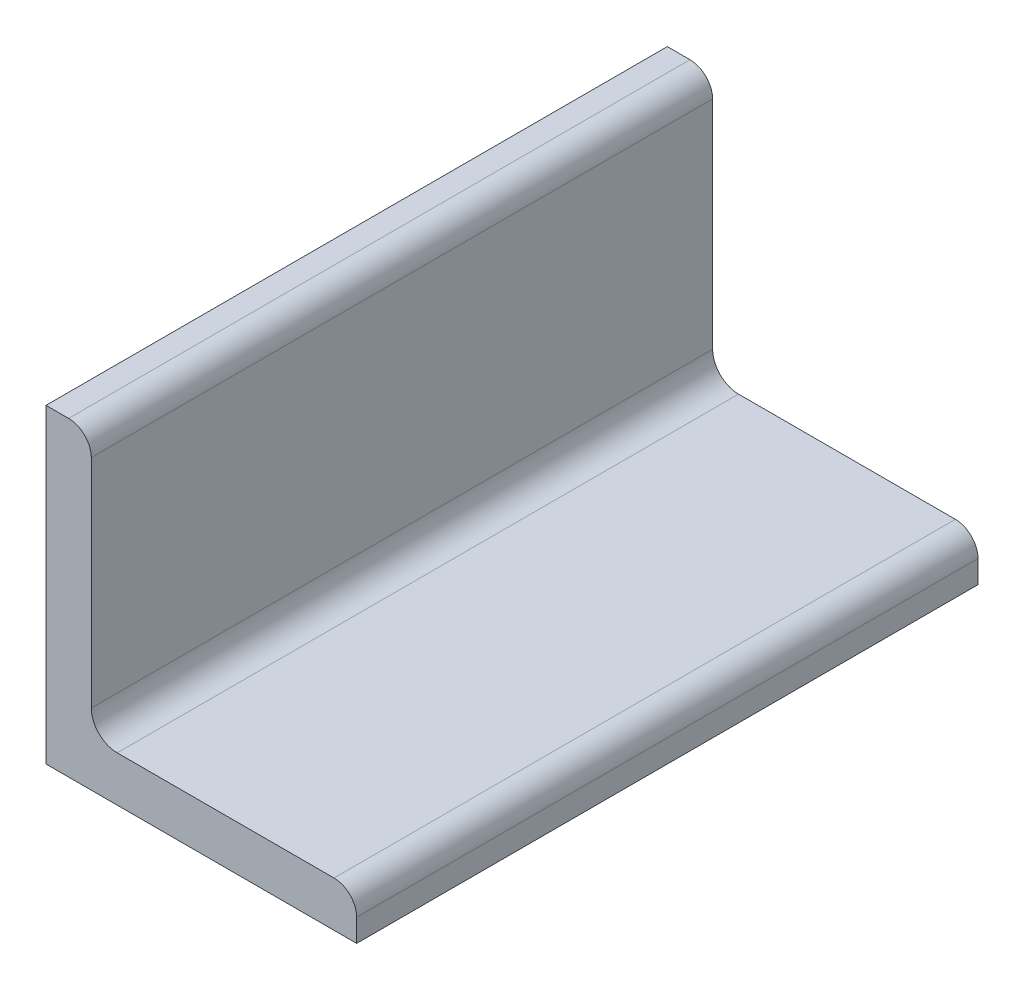
ISO-10303-21;
HEADER;
FILE_DESCRIPTION(('STEP AP214'),'2;1');
FILE_NAME('part.step','',(''),(''),'','','');
FILE_SCHEMA(('AUTOMOTIVE_DESIGN { 1 0 10303 214 1 1 1 1 }'));
ENDSEC;
DATA;
#1=APPLICATION_CONTEXT('core data for automotive mechanical design processes');
#2=APPLICATION_PROTOCOL_DEFINITION('international standard','automotive_design',2000,#1);
#3=PRODUCT_CONTEXT('',#1,'mechanical');
#4=PRODUCT('Part','Part','',(#3));
#5=PRODUCT_RELATED_PRODUCT_CATEGORY('part','',(#4));
#6=PRODUCT_DEFINITION_FORMATION('','',#4);
#7=PRODUCT_DEFINITION_CONTEXT('part definition',#1,'design');
#8=PRODUCT_DEFINITION('design','',#6,#7);
#9=PRODUCT_DEFINITION_SHAPE('','',#8);
#10=(LENGTH_UNIT() NAMED_UNIT(*) SI_UNIT(.MILLI.,.METRE.));
#11=(NAMED_UNIT(*) PLANE_ANGLE_UNIT() SI_UNIT($,.RADIAN.));
#12=(NAMED_UNIT(*) SI_UNIT($,.STERADIAN.) SOLID_ANGLE_UNIT());
#13=UNCERTAINTY_MEASURE_WITH_UNIT(LENGTH_MEASURE(1.E-05),#10,'distance_accuracy_value','');
#14=(GEOMETRIC_REPRESENTATION_CONTEXT(3) GLOBAL_UNCERTAINTY_ASSIGNED_CONTEXT((#13)) GLOBAL_UNIT_ASSIGNED_CONTEXT((#10,
#11,#12)) REPRESENTATION_CONTEXT('',''));
#15=CARTESIAN_POINT('',(0.,0.,0.));
#16=DIRECTION('',(0.,0.,1.));
#17=DIRECTION('',(1.,0.,0.));
#18=AXIS2_PLACEMENT_3D('',#15,#16,#17);
#19=CARTESIAN_POINT('',(0.425014111727251,152.925428131371,304.8));
#20=DIRECTION('',(1.,0.,0.));
#21=DIRECTION('',(0.,0.,-1.));
#22=AXIS2_PLACEMENT_3D('',#19,#20,#21);
#23=PLANE('',#22);
#24=DIRECTION('',(0.,-1.,0.));
#25=VECTOR('',#24,1.);
#26=CARTESIAN_POINT('',(0.425014111727251,152.925428131371,0.));
#27=LINE('',#26,#25);
#28=CARTESIAN_POINT('',(0.425014111727251,152.925428131371,0.));
#29=VERTEX_POINT('',#28);
#30=CARTESIAN_POINT('',(0.425014111727251,0.52542813137111,0.));
#31=VERTEX_POINT('',#30);
#32=EDGE_CURVE('E135',#29,#31,#27,.T.);
#33=ORIENTED_EDGE('',*,*,#32,.T.);
#34=DIRECTION('',(0.,0.,-1.));
#35=VECTOR('',#34,1.);
#36=CARTESIAN_POINT('',(0.425014111727251,0.52542813137111,304.8));
#37=LINE('',#36,#35);
#38=CARTESIAN_POINT('',(0.425014111727251,0.52542813137111,304.8));
#39=VERTEX_POINT('',#38);
#40=EDGE_CURVE('E11',#39,#31,#37,.T.);
#41=ORIENTED_EDGE('',*,*,#40,.F.);
#42=DIRECTION('',(0.,-1.,0.));
#43=VECTOR('',#42,1.);
#44=CARTESIAN_POINT('',(0.425014111727251,152.925428131371,304.8));
#45=LINE('',#44,#43);
#46=CARTESIAN_POINT('',(0.425014111727251,152.925428131371,304.8));
#47=VERTEX_POINT('',#46);
#48=EDGE_CURVE('E151',#47,#39,#45,.T.);
#49=ORIENTED_EDGE('',*,*,#48,.F.);
#50=DIRECTION('',(0.,0.,-1.));
#51=VECTOR('',#50,1.);
#52=CARTESIAN_POINT('',(0.425014111727251,152.925428131371,304.8));
#53=LINE('',#52,#51);
#54=EDGE_CURVE('E131',#47,#29,#53,.T.);
#55=ORIENTED_EDGE('',*,*,#54,.T.);
#56=EDGE_LOOP('',(#33,#41,#49,#55));
#57=FACE_BOUND('',#56,.T.);
#58=ADVANCED_FACE('F33',(#57),#23,.F.);
#59=CARTESIAN_POINT('',(0.425014111727251,0.52542813137111,304.8));
#60=DIRECTION('',(0.,1.,0.));
#61=DIRECTION('',(0.,0.,1.));
#62=AXIS2_PLACEMENT_3D('',#59,#60,#61);
#63=PLANE('',#62);
#64=DIRECTION('',(1.,0.,0.));
#65=VECTOR('',#64,1.);
#66=CARTESIAN_POINT('',(0.425014111727251,0.52542813137111,0.));
#67=LINE('',#66,#65);
#68=CARTESIAN_POINT('',(152.825014111727,0.52542813137111,0.));
#69=VERTEX_POINT('',#68);
#70=EDGE_CURVE('E138',#31,#69,#67,.T.);
#71=ORIENTED_EDGE('',*,*,#70,.T.);
#72=DIRECTION('',(0.,0.,-1.));
#73=VECTOR('',#72,1.);
#74=CARTESIAN_POINT('',(152.825014111727,0.52542813137111,304.8));
#75=LINE('',#74,#73);
#76=CARTESIAN_POINT('',(152.825014111727,0.52542813137111,304.8));
#77=VERTEX_POINT('',#76);
#78=EDGE_CURVE('E41',#77,#69,#75,.T.);
#79=ORIENTED_EDGE('',*,*,#78,.F.);
#80=DIRECTION('',(1.,0.,0.));
#81=VECTOR('',#80,1.);
#82=CARTESIAN_POINT('',(0.425014111727251,0.52542813137111,304.8));
#83=LINE('',#82,#81);
#84=EDGE_CURVE('E95',#39,#77,#83,.T.);
#85=ORIENTED_EDGE('',*,*,#84,.F.);
#86=ORIENTED_EDGE('',*,*,#40,.T.);
#87=EDGE_LOOP('',(#71,#79,#85,#86));
#88=FACE_BOUND('',#87,.T.);
#89=ADVANCED_FACE('F194',(#88),#63,.F.);
#90=CARTESIAN_POINT('',(152.825014111727,0.52542813137111,304.8));
#91=DIRECTION('',(-1.,0.,0.));
#92=DIRECTION('',(0.,0.,1.));
#93=AXIS2_PLACEMENT_3D('',#90,#91,#92);
#94=PLANE('',#93);
#95=DIRECTION('',(0.,1.,0.));
#96=VECTOR('',#95,1.);
#97=CARTESIAN_POINT('',(152.825014111727,0.52542813137111,0.));
#98=LINE('',#97,#96);
#99=CARTESIAN_POINT('',(152.825014111727,11.6379281313711,0.));
#100=VERTEX_POINT('',#99);
#101=EDGE_CURVE('E140',#69,#100,#98,.T.);
#102=ORIENTED_EDGE('',*,*,#101,.T.);
#103=DIRECTION('',(0.,0.,-1.));
#104=VECTOR('',#103,1.);
#105=CARTESIAN_POINT('',(152.825014111727,11.6379281313711,304.8));
#106=LINE('',#105,#104);
#107=CARTESIAN_POINT('',(152.825014111727,11.6379281313711,304.8));
#108=VERTEX_POINT('',#107);
#109=EDGE_CURVE('E161',#108,#100,#106,.T.);
#110=ORIENTED_EDGE('',*,*,#109,.F.);
#111=DIRECTION('',(0.,1.,0.));
#112=VECTOR('',#111,1.);
#113=CARTESIAN_POINT('',(152.825014111727,0.52542813137111,304.8));
#114=LINE('',#113,#112);
#115=EDGE_CURVE('E169',#77,#108,#114,.T.);
#116=ORIENTED_EDGE('',*,*,#115,.F.);
#117=ORIENTED_EDGE('',*,*,#78,.T.);
#118=EDGE_LOOP('',(#102,#110,#116,#117));
#119=FACE_BOUND('',#118,.T.);
#120=ADVANCED_FACE('F167',(#119),#94,.F.);
#121=CARTESIAN_POINT('',(141.712514111727,11.6379281313711,304.8));
#122=DIRECTION('',(0.,0.,-1.));
#123=DIRECTION('',(-1.,0.,0.));
#124=AXIS2_PLACEMENT_3D('',#121,#122,#123);
#125=CYLINDRICAL_SURFACE('',#124,11.1125);
#126=CARTESIAN_POINT('',(141.712514111727,11.6379281313711,0.));
#127=DIRECTION('',(0.,0.,1.));
#128=DIRECTION('',(1.,0.,0.));
#129=AXIS2_PLACEMENT_3D('',#126,#127,#128);
#130=CIRCLE('',#129,11.1125);
#131=CARTESIAN_POINT('',(141.712514111727,22.7504281313711,0.));
#132=VERTEX_POINT('',#131);
#133=EDGE_CURVE('E142',#100,#132,#130,.T.);
#134=ORIENTED_EDGE('',*,*,#133,.T.);
#135=DIRECTION('',(0.,0.,-1.));
#136=VECTOR('',#135,1.);
#137=CARTESIAN_POINT('',(141.712514111727,22.7504281313711,304.8));
#138=LINE('',#137,#136);
#139=CARTESIAN_POINT('',(141.712514111727,22.7504281313711,304.8));
#140=VERTEX_POINT('',#139);
#141=EDGE_CURVE('E158',#140,#132,#138,.T.);
#142=ORIENTED_EDGE('',*,*,#141,.F.);
#143=CARTESIAN_POINT('',(141.712514111727,11.6379281313711,304.8));
#144=DIRECTION('',(0.,0.,1.));
#145=DIRECTION('',(1.,0.,0.));
#146=AXIS2_PLACEMENT_3D('',#143,#144,#145);
#147=CIRCLE('',#146,11.1125);
#148=EDGE_CURVE('E185',#108,#140,#147,.T.);
#149=ORIENTED_EDGE('',*,*,#148,.F.);
#150=ORIENTED_EDGE('',*,*,#109,.T.);
#151=EDGE_LOOP('',(#134,#142,#149,#150));
#152=FACE_BOUND('',#151,.T.);
#153=ADVANCED_FACE('F178',(#152),#125,.T.);
#154=CARTESIAN_POINT('',(141.712514111727,22.7504281313711,304.8));
#155=DIRECTION('',(0.,-1.,0.));
#156=DIRECTION('',(0.,0.,-1.));
#157=AXIS2_PLACEMENT_3D('',#154,#155,#156);
#158=PLANE('',#157);
#159=DIRECTION('',(-1.,0.,0.));
#160=VECTOR('',#159,1.);
#161=CARTESIAN_POINT('',(141.712514111727,22.7504281313711,0.));
#162=LINE('',#161,#160);
#163=CARTESIAN_POINT('',(35.3500141117272,22.7504281313711,0.));
#164=VERTEX_POINT('',#163);
#165=EDGE_CURVE('E144',#132,#164,#162,.T.);
#166=ORIENTED_EDGE('',*,*,#165,.T.);
#167=DIRECTION('',(0.,0.,-1.));
#168=VECTOR('',#167,1.);
#169=CARTESIAN_POINT('',(35.3500141117272,22.7504281313711,304.8));
#170=LINE('',#169,#168);
#171=CARTESIAN_POINT('',(35.3500141117272,22.7504281313711,304.8));
#172=VERTEX_POINT('',#171);
#173=EDGE_CURVE('E155',#172,#164,#170,.T.);
#174=ORIENTED_EDGE('',*,*,#173,.F.);
#175=DIRECTION('',(-1.,0.,0.));
#176=VECTOR('',#175,1.);
#177=CARTESIAN_POINT('',(141.712514111727,22.7504281313711,304.8));
#178=LINE('',#177,#176);
#179=EDGE_CURVE('E184',#140,#172,#178,.T.);
#180=ORIENTED_EDGE('',*,*,#179,.F.);
#181=ORIENTED_EDGE('',*,*,#141,.T.);
#182=EDGE_LOOP('',(#166,#174,#180,#181));
#183=FACE_BOUND('',#182,.T.);
#184=ADVANCED_FACE('F182',(#183),#158,.F.);
#185=CARTESIAN_POINT('',(35.3500141117272,35.4504281313711,304.8));
#186=DIRECTION('',(0.,0.,-1.));
#187=DIRECTION('',(-1.,0.,0.));
#188=AXIS2_PLACEMENT_3D('',#185,#186,#187);
#189=CYLINDRICAL_SURFACE('',#188,12.7);
#190=CARTESIAN_POINT('',(35.3500141117272,35.4504281313711,0.));
#191=DIRECTION('',(0.,0.,-1.));
#192=DIRECTION('',(1.,0.,0.));
#193=AXIS2_PLACEMENT_3D('',#190,#191,#192);
#194=CIRCLE('',#193,12.7);
#195=CARTESIAN_POINT('',(22.6500141117272,35.4504281313711,0.));
#196=VERTEX_POINT('',#195);
#197=EDGE_CURVE('E146',#164,#196,#194,.T.);
#198=ORIENTED_EDGE('',*,*,#197,.T.);
#199=DIRECTION('',(0.,0.,-1.));
#200=VECTOR('',#199,1.);
#201=CARTESIAN_POINT('',(22.6500141117272,35.4504281313711,304.8));
#202=LINE('',#201,#200);
#203=CARTESIAN_POINT('',(22.6500141117272,35.4504281313711,304.8));
#204=VERTEX_POINT('',#203);
#205=EDGE_CURVE('E126',#204,#196,#202,.T.);
#206=ORIENTED_EDGE('',*,*,#205,.F.);
#207=CARTESIAN_POINT('',(35.3500141117272,35.4504281313711,304.8));
#208=DIRECTION('',(0.,0.,-1.));
#209=DIRECTION('',(1.,0.,0.));
#210=AXIS2_PLACEMENT_3D('',#207,#208,#209);
#211=CIRCLE('',#210,12.7);
#212=EDGE_CURVE('E117',#172,#204,#211,.T.);
#213=ORIENTED_EDGE('',*,*,#212,.F.);
#214=ORIENTED_EDGE('',*,*,#173,.T.);
#215=EDGE_LOOP('',(#198,#206,#213,#214));
#216=FACE_BOUND('',#215,.T.);
#217=ADVANCED_FACE('F206',(#216),#189,.F.);
#218=CARTESIAN_POINT('',(22.6500141117273,35.4504281313711,304.8));
#219=DIRECTION('',(-1.,0.,0.));
#220=DIRECTION('',(0.,0.,1.));
#221=AXIS2_PLACEMENT_3D('',#218,#219,#220);
#222=PLANE('',#221);
#223=DIRECTION('',(0.,1.,0.));
#224=VECTOR('',#223,1.);
#225=CARTESIAN_POINT('',(22.6500141117273,35.4504281313711,0.));
#226=LINE('',#225,#224);
#227=CARTESIAN_POINT('',(22.6500141117273,141.812928131371,0.));
#228=VERTEX_POINT('',#227);
#229=EDGE_CURVE('E125',#196,#228,#226,.T.);
#230=ORIENTED_EDGE('',*,*,#229,.T.);
#231=DIRECTION('',(0.,0.,-1.));
#232=VECTOR('',#231,1.);
#233=CARTESIAN_POINT('',(22.6500141117273,141.812928131371,304.8));
#234=LINE('',#233,#232);
#235=CARTESIAN_POINT('',(22.6500141117273,141.812928131371,304.8));
#236=VERTEX_POINT('',#235);
#237=EDGE_CURVE('E122',#236,#228,#234,.T.);
#238=ORIENTED_EDGE('',*,*,#237,.F.);
#239=DIRECTION('',(0.,1.,0.));
#240=VECTOR('',#239,1.);
#241=CARTESIAN_POINT('',(22.6500141117273,35.4504281313711,304.8));
#242=LINE('',#241,#240);
#243=EDGE_CURVE('E111',#204,#236,#242,.T.);
#244=ORIENTED_EDGE('',*,*,#243,.F.);
#245=ORIENTED_EDGE('',*,*,#205,.T.);
#246=EDGE_LOOP('',(#230,#238,#244,#245));
#247=FACE_BOUND('',#246,.T.);
#248=ADVANCED_FACE('F123',(#247),#222,.F.);
#249=CARTESIAN_POINT('',(11.5375141117272,141.812928131371,304.8));
#250=DIRECTION('',(0.,0.,-1.));
#251=DIRECTION('',(-1.,0.,0.));
#252=AXIS2_PLACEMENT_3D('',#249,#250,#251);
#253=CYLINDRICAL_SURFACE('',#252,11.1125);
#254=CARTESIAN_POINT('',(11.5375141117272,141.812928131371,0.));
#255=DIRECTION('',(0.,0.,1.));
#256=DIRECTION('',(1.,0.,0.));
#257=AXIS2_PLACEMENT_3D('',#254,#255,#256);
#258=CIRCLE('',#257,11.1125);
#259=CARTESIAN_POINT('',(11.5375141117273,152.925428131371,0.));
#260=VERTEX_POINT('',#259);
#261=EDGE_CURVE('E81',#228,#260,#258,.T.);
#262=ORIENTED_EDGE('',*,*,#261,.T.);
#263=DIRECTION('',(0.,0.,-1.));
#264=VECTOR('',#263,1.);
#265=CARTESIAN_POINT('',(11.5375141117273,152.925428131371,304.8));
#266=LINE('',#265,#264);
#267=CARTESIAN_POINT('',(11.5375141117273,152.925428131371,304.8));
#268=VERTEX_POINT('',#267);
#269=EDGE_CURVE('E127',#268,#260,#266,.T.);
#270=ORIENTED_EDGE('',*,*,#269,.F.);
#271=CARTESIAN_POINT('',(11.5375141117272,141.812928131371,304.8));
#272=DIRECTION('',(0.,0.,1.));
#273=DIRECTION('',(1.,0.,0.));
#274=AXIS2_PLACEMENT_3D('',#271,#272,#273);
#275=CIRCLE('',#274,11.1125);
#276=EDGE_CURVE('E115',#236,#268,#275,.T.);
#277=ORIENTED_EDGE('',*,*,#276,.F.);
#278=ORIENTED_EDGE('',*,*,#237,.T.);
#279=EDGE_LOOP('',(#262,#270,#277,#278));
#280=FACE_BOUND('',#279,.T.);
#281=ADVANCED_FACE('F129',(#280),#253,.T.);
#282=CARTESIAN_POINT('',(11.5375141117273,152.925428131371,304.8));
#283=DIRECTION('',(0.,-1.,0.));
#284=DIRECTION('',(0.,0.,-1.));
#285=AXIS2_PLACEMENT_3D('',#282,#283,#284);
#286=PLANE('',#285);
#287=DIRECTION('',(-1.,0.,0.));
#288=VECTOR('',#287,1.);
#289=CARTESIAN_POINT('',(11.5375141117273,152.925428131371,0.));
#290=LINE('',#289,#288);
#291=EDGE_CURVE('E87',#260,#29,#290,.T.);
#292=ORIENTED_EDGE('',*,*,#291,.T.);
#293=ORIENTED_EDGE('',*,*,#54,.F.);
#294=DIRECTION('',(-1.,0.,0.));
#295=VECTOR('',#294,1.);
#296=CARTESIAN_POINT('',(11.5375141117273,152.925428131371,304.8));
#297=LINE('',#296,#295);
#298=EDGE_CURVE('E49',#268,#47,#297,.T.);
#299=ORIENTED_EDGE('',*,*,#298,.F.);
#300=ORIENTED_EDGE('',*,*,#269,.T.);
#301=EDGE_LOOP('',(#292,#293,#299,#300));
#302=FACE_BOUND('',#301,.T.);
#303=ADVANCED_FACE('F214',(#302),#286,.F.);
#304=CARTESIAN_POINT('',(141.712514111727,11.6379281313711,304.8));
#305=DIRECTION('',(0.,0.,1.));
#306=DIRECTION('',(1.,0.,0.));
#307=AXIS2_PLACEMENT_3D('',#304,#305,#306);
#308=PLANE('',#307);
#309=ORIENTED_EDGE('',*,*,#48,.T.);
#310=ORIENTED_EDGE('',*,*,#84,.T.);
#311=ORIENTED_EDGE('',*,*,#115,.T.);
#312=ORIENTED_EDGE('',*,*,#148,.T.);
#313=ORIENTED_EDGE('',*,*,#179,.T.);
#314=ORIENTED_EDGE('',*,*,#212,.T.);
#315=ORIENTED_EDGE('',*,*,#243,.T.);
#316=ORIENTED_EDGE('',*,*,#276,.T.);
#317=ORIENTED_EDGE('',*,*,#298,.T.);
#318=EDGE_LOOP('',(#309,#310,#311,#312,#313,#314,#315,#316,#317));
#319=FACE_BOUND('',#318,.T.);
#320=ADVANCED_FACE('F113',(#319),#308,.T.);
#321=CARTESIAN_POINT('',(141.712514111727,11.6379281313711,0.));
#322=DIRECTION('',(0.,0.,1.));
#323=DIRECTION('',(1.,0.,0.));
#324=AXIS2_PLACEMENT_3D('',#321,#322,#323);
#325=PLANE('',#324);
#326=ORIENTED_EDGE('',*,*,#32,.F.);
#327=ORIENTED_EDGE('',*,*,#291,.F.);
#328=ORIENTED_EDGE('',*,*,#261,.F.);
#329=ORIENTED_EDGE('',*,*,#229,.F.);
#330=ORIENTED_EDGE('',*,*,#197,.F.);
#331=ORIENTED_EDGE('',*,*,#165,.F.);
#332=ORIENTED_EDGE('',*,*,#133,.F.);
#333=ORIENTED_EDGE('',*,*,#101,.F.);
#334=ORIENTED_EDGE('',*,*,#70,.F.);
#335=EDGE_LOOP('',(#326,#327,#328,#329,#330,#331,#332,#333,#334));
#336=FACE_BOUND('',#335,.T.);
#337=ADVANCED_FACE('F173',(#336),#325,.F.);
#338=CLOSED_SHELL('',(#58,#89,#120,#153,#184,#217,#248,#281,#303,#320,#337));
#339=MANIFOLD_SOLID_BREP('B2',#338);
#340=ADVANCED_BREP_SHAPE_REPRESENTATION('',(#18,#339),#14);
#341=SHAPE_DEFINITION_REPRESENTATION(#9,#340);
ENDSEC;
END-ISO-10303-21;
